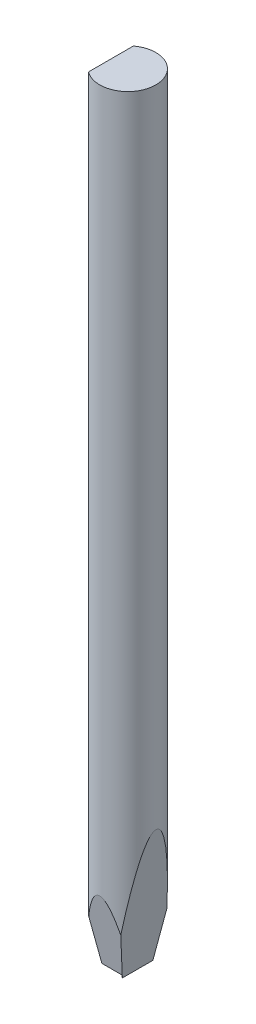
ISO-10303-21;
HEADER;
FILE_DESCRIPTION(('STEP AP214'),'2;1');
FILE_NAME('part.step','',(''),(''),'','','');
FILE_SCHEMA(('AUTOMOTIVE_DESIGN { 1 0 10303 214 1 1 1 1 }'));
ENDSEC;
DATA;
#1=APPLICATION_CONTEXT('core data for automotive mechanical design processes');
#2=APPLICATION_PROTOCOL_DEFINITION('international standard','automotive_design',2000,#1);
#3=PRODUCT_CONTEXT('',#1,'mechanical');
#4=PRODUCT('Part','Part','',(#3));
#5=PRODUCT_RELATED_PRODUCT_CATEGORY('part','',(#4));
#6=PRODUCT_DEFINITION_FORMATION('','',#4);
#7=PRODUCT_DEFINITION_CONTEXT('part definition',#1,'design');
#8=PRODUCT_DEFINITION('design','',#6,#7);
#9=PRODUCT_DEFINITION_SHAPE('','',#8);
#10=(LENGTH_UNIT() NAMED_UNIT(*) SI_UNIT(.MILLI.,.METRE.));
#11=(NAMED_UNIT(*) PLANE_ANGLE_UNIT() SI_UNIT($,.RADIAN.));
#12=(NAMED_UNIT(*) SI_UNIT($,.STERADIAN.) SOLID_ANGLE_UNIT());
#13=UNCERTAINTY_MEASURE_WITH_UNIT(LENGTH_MEASURE(1.E-05),#10,'distance_accuracy_value','');
#14=(GEOMETRIC_REPRESENTATION_CONTEXT(3) GLOBAL_UNCERTAINTY_ASSIGNED_CONTEXT((#13)) GLOBAL_UNIT_ASSIGNED_CONTEXT((#10,
#11,#12)) REPRESENTATION_CONTEXT('',''));
#15=CARTESIAN_POINT('',(0.,0.,0.));
#16=DIRECTION('',(0.,0.,1.));
#17=DIRECTION('',(1.,0.,0.));
#18=AXIS2_PLACEMENT_3D('',#15,#16,#17);
#19=CARTESIAN_POINT('',(0.,28.9814,0.));
#20=DIRECTION('',(0.,-1.,0.));
#21=DIRECTION('',(0.,0.,-1.));
#22=AXIS2_PLACEMENT_3D('',#19,#20,#21);
#23=CYLINDRICAL_SURFACE('',#22,0.99949);
#24=CARTESIAN_POINT('',(0.,-1.08262214405472,0.));
#25=DIRECTION('',(-0.99026806874157,-0.139173100960066,0.));
#26=DIRECTION('',(0.139173100960066,-0.99026806874157,0.));
#27=AXIS2_PLACEMENT_3D('',#24,#25,#26);
#28=ELLIPSE('',#27,7.18163203309519,0.99949);
#29=CARTESIAN_POINT('',(-0.568490062240914,2.96239483229058,0.822070136444161));
#30=VERTEX_POINT('',#29);
#31=CARTESIAN_POINT('',(-0.60071,3.19165160187869,0.798828990460412));
#32=VERTEX_POINT('',#31);
#33=EDGE_CURVE('E55',#30,#32,#28,.T.);
#34=ORIENTED_EDGE('',*,*,#33,.F.);
#35=CARTESIAN_POINT('',(0.,-1.6997965869758,0.));
#36=DIRECTION('',(0.,-0.173648177666931,0.984807753012208));
#37=DIRECTION('',(0.,-0.984807753012208,-0.173648177666931));
#38=AXIS2_PLACEMENT_3D('',#35,#36,#37);
#39=ELLIPSE('',#38,5.7558335101972,0.99949);
#40=CARTESIAN_POINT('',(0.570126281039121,2.9559640948918,0.820936223934905));
#41=VERTEX_POINT('',#40);
#42=EDGE_CURVE('E48',#41,#30,#39,.T.);
#43=ORIENTED_EDGE('',*,*,#42,.F.);
#44=CARTESIAN_POINT('',(0.,-1.10069518314968,0.));
#45=DIRECTION('',(0.990268068741571,-0.139173100960058,0.));
#46=DIRECTION('',(-0.139173100960058,-0.990268068741571,0.));
#47=AXIS2_PLACEMENT_3D('',#44,#45,#46);
#48=ELLIPSE('',#47,7.18163203309558,0.99949);
#49=CARTESIAN_POINT('',(0.570126281039121,2.9559640948918,-0.820936223934905));
#50=VERTEX_POINT('',#49);
#51=EDGE_CURVE('E121',#50,#41,#48,.T.);
#52=ORIENTED_EDGE('',*,*,#51,.F.);
#53=CARTESIAN_POINT('',(0.,-1.6997965869758,0.));
#54=DIRECTION('',(0.,-0.173648177666931,-0.984807753012208));
#55=DIRECTION('',(0.,-0.984807753012208,0.173648177666931));
#56=AXIS2_PLACEMENT_3D('',#53,#54,#55);
#57=ELLIPSE('',#56,5.7558335101972,0.99949);
#58=CARTESIAN_POINT('',(-0.568490062240914,2.96239483229058,-0.822070136444161));
#59=VERTEX_POINT('',#58);
#60=EDGE_CURVE('E11',#59,#50,#57,.T.);
#61=ORIENTED_EDGE('',*,*,#60,.F.);
#62=CARTESIAN_POINT('',(-0.60071,3.19165160187869,-0.798828990460412));
#63=VERTEX_POINT('',#62);
#64=EDGE_CURVE('E125',#63,#59,#28,.T.);
#65=ORIENTED_EDGE('',*,*,#64,.F.);
#66=DIRECTION('',(0.,-1.,0.));
#67=VECTOR('',#66,1.);
#68=CARTESIAN_POINT('',(-0.60071,28.9814,-0.798828990460412));
#69=LINE('',#68,#67);
#70=CARTESIAN_POINT('',(-0.60071,28.9814,-0.798828990460412));
#71=VERTEX_POINT('',#70);
#72=EDGE_CURVE('E134',#71,#63,#69,.T.);
#73=ORIENTED_EDGE('',*,*,#72,.F.);
#74=CARTESIAN_POINT('',(0.,28.9814,0.));
#75=DIRECTION('',(0.,1.,0.));
#76=DIRECTION('',(0.,0.,1.));
#77=AXIS2_PLACEMENT_3D('',#74,#75,#76);
#78=CIRCLE('',#77,0.99949);
#79=CARTESIAN_POINT('',(-0.60071,28.9814,0.798828990460412));
#80=VERTEX_POINT('',#79);
#81=EDGE_CURVE('E136',#80,#71,#78,.T.);
#82=ORIENTED_EDGE('',*,*,#81,.F.);
#83=DIRECTION('',(0.,-1.,0.));
#84=VECTOR('',#83,1.);
#85=CARTESIAN_POINT('',(-0.60071,28.9814,0.798828990460412));
#86=LINE('',#85,#84);
#87=EDGE_CURVE('E132',#32,#80,#86,.F.);
#88=ORIENTED_EDGE('',*,*,#87,.F.);
#89=EDGE_LOOP('',(#34,#43,#52,#61,#65,#73,#82,#88));
#90=FACE_BOUND('',#89,.T.);
#91=ADVANCED_FACE('F41',(#90),#23,.T.);
#92=CARTESIAN_POINT('',(-0.60071,28.9814,1.00948998));
#93=DIRECTION('',(-1.,0.,0.));
#94=DIRECTION('',(0.,0.,1.));
#95=AXIS2_PLACEMENT_3D('',#92,#93,#94);
#96=PLANE('',#95);
#97=ORIENTED_EDGE('',*,*,#72,.T.);
#98=DIRECTION('',(0.,0.,1.));
#99=VECTOR('',#98,1.);
#100=CARTESIAN_POINT('',(-0.60071,3.19165160187869,1.00948998));
#101=LINE('',#100,#99);
#102=EDGE_CURVE('E139',#63,#32,#101,.T.);
#103=ORIENTED_EDGE('',*,*,#102,.T.);
#104=ORIENTED_EDGE('',*,*,#87,.T.);
#105=DIRECTION('',(0.,0.,-1.));
#106=VECTOR('',#105,1.);
#107=CARTESIAN_POINT('',(-0.60071,28.9814,1.00948998));
#108=LINE('',#107,#106);
#109=EDGE_CURVE('E63',#80,#71,#108,.T.);
#110=ORIENTED_EDGE('',*,*,#109,.T.);
#111=EDGE_LOOP('',(#97,#103,#104,#110));
#112=FACE_BOUND('',#111,.T.);
#113=ADVANCED_FACE('F149',(#112),#96,.T.);
#114=CARTESIAN_POINT('',(0.,28.9814,0.));
#115=DIRECTION('',(0.,1.,0.));
#116=DIRECTION('',(0.,0.,1.));
#117=AXIS2_PLACEMENT_3D('',#114,#115,#116);
#118=PLANE('',#117);
#119=ORIENTED_EDGE('',*,*,#81,.T.);
#120=ORIENTED_EDGE('',*,*,#109,.F.);
#121=EDGE_LOOP('',(#119,#120));
#122=FACE_BOUND('',#121,.T.);
#123=ADVANCED_FACE('F151',(#122),#118,.T.);
#124=CARTESIAN_POINT('',(1.00948998,0.,-0.29972));
#125=DIRECTION('',(0.,-0.173648177666931,-0.984807753012208));
#126=DIRECTION('',(0.,0.984807753012208,-0.173648177666931));
#127=AXIS2_PLACEMENT_3D('',#124,#125,#126);
#128=PLANE('',#127);
#129=ORIENTED_EDGE('',*,*,#60,.T.);
#130=DIRECTION('',(-0.137098791054058,-0.975508586841574,0.172008483772957));
#131=VECTOR('',#130,1.);
#132=CARTESIAN_POINT('',(0.17075945808405,0.114321494712369,-0.319877963992711));
#133=LINE('',#132,#131);
#134=CARTESIAN_POINT('',(0.34925,1.38434769239313,-0.543817848850414));
#135=VERTEX_POINT('',#134);
#136=EDGE_CURVE('E122',#50,#135,#133,.T.);
#137=ORIENTED_EDGE('',*,*,#136,.T.);
#138=DIRECTION('',(0.,0.984807753012208,-0.173648177666931));
#139=VECTOR('',#138,1.);
#140=CARTESIAN_POINT('',(0.34925,0.,-0.29972));
#141=LINE('',#140,#139);
#142=CARTESIAN_POINT('',(0.34925,1.48860002,-0.562200347009162));
#143=VERTEX_POINT('',#142);
#144=EDGE_CURVE('E112',#135,#143,#141,.T.);
#145=ORIENTED_EDGE('',*,*,#144,.T.);
#146=DIRECTION('',(-1.,0.,0.));
#147=VECTOR('',#146,1.);
#148=CARTESIAN_POINT('',(1.00948998,1.48860002,-0.562200347009162));
#149=LINE('',#148,#147);
#150=CARTESIAN_POINT('',(-0.361361709141541,1.48860002,-0.562200347009162));
#151=VERTEX_POINT('',#150);
#152=EDGE_CURVE('E254',#143,#151,#149,.T.);
#153=ORIENTED_EDGE('',*,*,#152,.T.);
#154=DIRECTION('',(-0.137098791054065,0.975508586841573,-0.172008483772957));
#155=VECTOR('',#154,1.);
#156=CARTESIAN_POINT('',(-0.130318294288237,-0.155359298603446,-0.272325963952269));
#157=LINE('',#156,#155);
#158=EDGE_CURVE('E145',#151,#59,#157,.T.);
#159=ORIENTED_EDGE('',*,*,#158,.T.);
#160=EDGE_LOOP('',(#129,#137,#145,#153,#159));
#161=FACE_BOUND('',#160,.T.);
#162=ADVANCED_FACE('F153',(#161),#128,.T.);
#163=CARTESIAN_POINT('',(1.00948998,0.,0.29972));
#164=DIRECTION('',(0.,-0.173648177666931,0.984807753012208));
#165=DIRECTION('',(0.,-0.984807753012208,-0.173648177666931));
#166=AXIS2_PLACEMENT_3D('',#163,#164,#165);
#167=PLANE('',#166);
#168=ORIENTED_EDGE('',*,*,#42,.T.);
#169=DIRECTION('',(0.137098791054065,-0.975508586841573,-0.172008483772957));
#170=VECTOR('',#169,1.);
#171=CARTESIAN_POINT('',(-0.130318294288237,-0.155359298603446,0.272325963952269));
#172=LINE('',#171,#170);
#173=CARTESIAN_POINT('',(-0.361361709141541,1.48860002,0.562200347009162));
#174=VERTEX_POINT('',#173);
#175=EDGE_CURVE('E141',#30,#174,#172,.T.);
#176=ORIENTED_EDGE('',*,*,#175,.T.);
#177=DIRECTION('',(1.,0.,0.));
#178=VECTOR('',#177,1.);
#179=CARTESIAN_POINT('',(1.00948998,1.48860002,0.562200347009162));
#180=LINE('',#179,#178);
#181=CARTESIAN_POINT('',(0.34925,1.48860002,0.562200347009162));
#182=VERTEX_POINT('',#181);
#183=EDGE_CURVE('E106',#174,#182,#180,.T.);
#184=ORIENTED_EDGE('',*,*,#183,.T.);
#185=DIRECTION('',(0.,-0.984807753012208,-0.173648177666931));
#186=VECTOR('',#185,1.);
#187=CARTESIAN_POINT('',(0.34925,0.,0.29972));
#188=LINE('',#187,#186);
#189=CARTESIAN_POINT('',(0.34925,1.38434769239313,0.543817848850414));
#190=VERTEX_POINT('',#189);
#191=EDGE_CURVE('E100',#182,#190,#188,.T.);
#192=ORIENTED_EDGE('',*,*,#191,.T.);
#193=DIRECTION('',(0.137098791054058,0.975508586841574,0.172008483772957));
#194=VECTOR('',#193,1.);
#195=CARTESIAN_POINT('',(0.17075945808405,0.114321494712369,0.319877963992711));
#196=LINE('',#195,#194);
#197=EDGE_CURVE('E103',#190,#41,#196,.T.);
#198=ORIENTED_EDGE('',*,*,#197,.T.);
#199=EDGE_LOOP('',(#168,#176,#184,#192,#198));
#200=FACE_BOUND('',#199,.T.);
#201=ADVANCED_FACE('F102',(#200),#167,.T.);
#202=CARTESIAN_POINT('',(0.27178,0.83312,1.00948998));
#203=DIRECTION('',(0.990268068741571,-0.139173100960058,0.));
#204=DIRECTION('',(0.139173100960058,0.990268068741571,0.));
#205=AXIS2_PLACEMENT_3D('',#202,#203,#204);
#206=PLANE('',#205);
#207=ORIENTED_EDGE('',*,*,#51,.T.);
#208=ORIENTED_EDGE('',*,*,#197,.F.);
#209=DIRECTION('',(0.,0.,1.));
#210=VECTOR('',#209,1.);
#211=CARTESIAN_POINT('',(0.34925,1.38434769239313,1.00948998));
#212=LINE('',#211,#210);
#213=EDGE_CURVE('E118',#135,#190,#212,.T.);
#214=ORIENTED_EDGE('',*,*,#213,.F.);
#215=ORIENTED_EDGE('',*,*,#136,.F.);
#216=EDGE_LOOP('',(#207,#208,#214,#215));
#217=FACE_BOUND('',#216,.T.);
#218=ADVANCED_FACE('F116',(#217),#206,.T.);
#219=CARTESIAN_POINT('',(-0.26924,0.83312,1.00948998));
#220=DIRECTION('',(-0.99026806874157,-0.139173100960066,0.));
#221=DIRECTION('',(0.139173100960066,-0.99026806874157,0.));
#222=AXIS2_PLACEMENT_3D('',#219,#220,#221);
#223=PLANE('',#222);
#224=ORIENTED_EDGE('',*,*,#33,.T.);
#225=ORIENTED_EDGE('',*,*,#102,.F.);
#226=ORIENTED_EDGE('',*,*,#64,.T.);
#227=ORIENTED_EDGE('',*,*,#158,.F.);
#228=DIRECTION('',(0.,0.,-1.));
#229=VECTOR('',#228,1.);
#230=CARTESIAN_POINT('',(-0.361361709141541,1.48860002,1.00948998));
#231=LINE('',#230,#229);
#232=EDGE_CURVE('E111',#174,#151,#231,.T.);
#233=ORIENTED_EDGE('',*,*,#232,.F.);
#234=ORIENTED_EDGE('',*,*,#175,.F.);
#235=EDGE_LOOP('',(#224,#225,#226,#227,#233,#234));
#236=FACE_BOUND('',#235,.T.);
#237=ADVANCED_FACE('F144',(#236),#223,.T.);
#238=CARTESIAN_POINT('',(0.34925,1.48860002,1.00948998));
#239=DIRECTION('',(-1.,0.,0.));
#240=DIRECTION('',(0.,0.,1.));
#241=AXIS2_PLACEMENT_3D('',#238,#239,#240);
#242=PLANE('',#241);
#243=ORIENTED_EDGE('',*,*,#213,.T.);
#244=ORIENTED_EDGE('',*,*,#191,.F.);
#245=DIRECTION('',(0.,0.,-1.));
#246=VECTOR('',#245,1.);
#247=CARTESIAN_POINT('',(0.34925,1.48860002,1.00948998));
#248=LINE('',#247,#246);
#249=EDGE_CURVE('E255',#182,#143,#248,.T.);
#250=ORIENTED_EDGE('',*,*,#249,.T.);
#251=ORIENTED_EDGE('',*,*,#144,.F.);
#252=EDGE_LOOP('',(#243,#244,#250,#251));
#253=FACE_BOUND('',#252,.T.);
#254=ADVANCED_FACE('F124',(#253),#242,.T.);
#255=CARTESIAN_POINT('',(0.34925,1.48860002,1.00948998));
#256=DIRECTION('',(0.,-1.,0.));
#257=DIRECTION('',(0.,0.,-1.));
#258=AXIS2_PLACEMENT_3D('',#255,#256,#257);
#259=PLANE('',#258);
#260=ORIENTED_EDGE('',*,*,#232,.T.);
#261=ORIENTED_EDGE('',*,*,#152,.F.);
#262=ORIENTED_EDGE('',*,*,#249,.F.);
#263=ORIENTED_EDGE('',*,*,#183,.F.);
#264=EDGE_LOOP('',(#260,#261,#262,#263));
#265=FACE_BOUND('',#264,.T.);
#266=ADVANCED_FACE('F200',(#265),#259,.T.);
#267=CLOSED_SHELL('',(#91,#113,#123,#162,#201,#218,#237,#254,#266));
#268=MANIFOLD_SOLID_BREP('B2',#267);
#269=ADVANCED_BREP_SHAPE_REPRESENTATION('',(#18,#268),#14);
#270=SHAPE_DEFINITION_REPRESENTATION(#9,#269);
ENDSEC;
END-ISO-10303-21;
